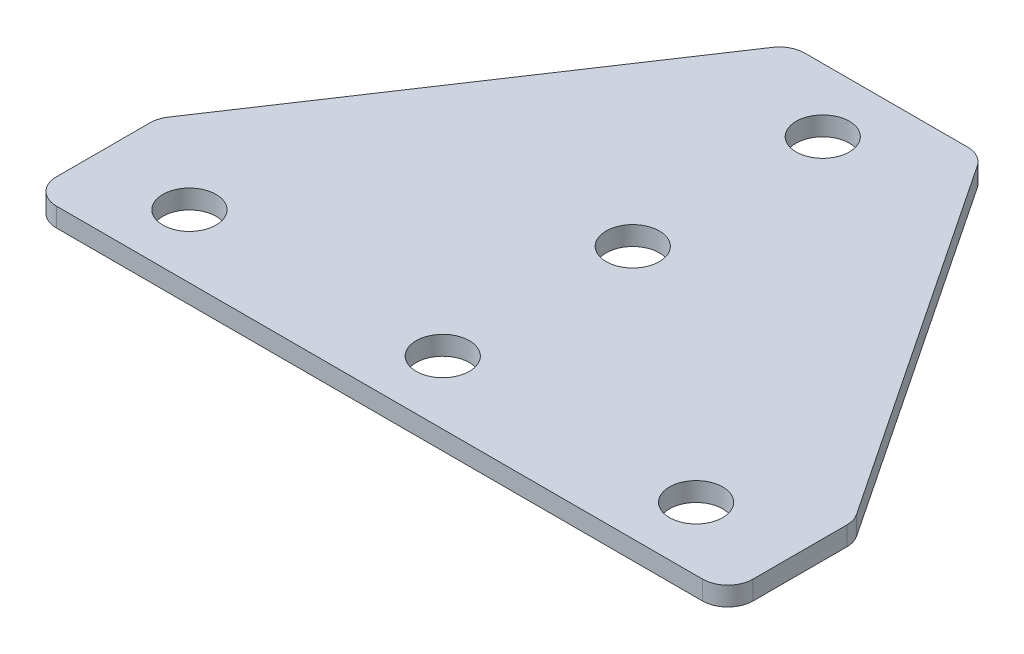
ISO-10303-21;
HEADER;
FILE_DESCRIPTION(('STEP AP214'),'2;1');
FILE_NAME('part.step','',(''),(''),'','','');
FILE_SCHEMA(('AUTOMOTIVE_DESIGN { 1 0 10303 214 1 1 1 1 }'));
ENDSEC;
DATA;
#1=APPLICATION_CONTEXT('core data for automotive mechanical design processes');
#2=APPLICATION_PROTOCOL_DEFINITION('international standard','automotive_design',2000,#1);
#3=PRODUCT_CONTEXT('',#1,'mechanical');
#4=PRODUCT('Part','Part','',(#3));
#5=PRODUCT_RELATED_PRODUCT_CATEGORY('part','',(#4));
#6=PRODUCT_DEFINITION_FORMATION('','',#4);
#7=PRODUCT_DEFINITION_CONTEXT('part definition',#1,'design');
#8=PRODUCT_DEFINITION('design','',#6,#7);
#9=PRODUCT_DEFINITION_SHAPE('','',#8);
#10=(LENGTH_UNIT() NAMED_UNIT(*) SI_UNIT(.MILLI.,.METRE.));
#11=(NAMED_UNIT(*) PLANE_ANGLE_UNIT() SI_UNIT($,.RADIAN.));
#12=(NAMED_UNIT(*) SI_UNIT($,.STERADIAN.) SOLID_ANGLE_UNIT());
#13=UNCERTAINTY_MEASURE_WITH_UNIT(LENGTH_MEASURE(1.E-05),#10,'distance_accuracy_value','');
#14=(GEOMETRIC_REPRESENTATION_CONTEXT(3) GLOBAL_UNCERTAINTY_ASSIGNED_CONTEXT((#13)) GLOBAL_UNIT_ASSIGNED_CONTEXT((#10,
#11,#12)) REPRESENTATION_CONTEXT('',''));
#15=CARTESIAN_POINT('',(0.,0.,0.));
#16=DIRECTION('',(0.,0.,1.));
#17=DIRECTION('',(1.,0.,0.));
#18=AXIS2_PLACEMENT_3D('',#15,#16,#17);
#19=CARTESIAN_POINT('',(0.,1.5,0.));
#20=DIRECTION('',(0.,1.,0.));
#21=DIRECTION('',(0.,0.,1.));
#22=AXIS2_PLACEMENT_3D('',#19,#20,#21);
#23=PLANE('',#22);
#24=CARTESIAN_POINT('',(27.5,1.5,-35.));
#25=DIRECTION('',(0.,1.,0.));
#26=DIRECTION('',(0.,0.,1.));
#27=AXIS2_PLACEMENT_3D('',#24,#25,#26);
#28=CIRCLE('',#27,2.1);
#29=CARTESIAN_POINT('',(27.5,1.5,-32.9));
#30=VERTEX_POINT('',#29);
#31=EDGE_CURVE('E250',#30,#30,#28,.T.);
#32=ORIENTED_EDGE('',*,*,#31,.F.);
#33=EDGE_LOOP('',(#32));
#34=FACE_BOUND('',#33,.T.);
#35=CARTESIAN_POINT('',(47.5,1.5,-5.));
#36=DIRECTION('',(0.,1.,0.));
#37=DIRECTION('',(0.,0.,-1.));
#38=AXIS2_PLACEMENT_3D('',#35,#36,#37);
#39=CIRCLE('',#38,2.1);
#40=CARTESIAN_POINT('',(47.5,1.5,-7.1));
#41=VERTEX_POINT('',#40);
#42=EDGE_CURVE('E239',#41,#41,#39,.T.);
#43=ORIENTED_EDGE('',*,*,#42,.F.);
#44=EDGE_LOOP('',(#43));
#45=FACE_BOUND('',#44,.T.);
#46=DIRECTION('',(-0.554700196225229,0.,0.832050294337843));
#47=VECTOR('',#46,1.);
#48=CARTESIAN_POINT('',(20.,1.5,-40.));
#49=LINE('',#48,#47);
#50=CARTESIAN_POINT('',(19.4062669283003,1.5,-39.1094003924505));
#51=VERTEX_POINT('',#50);
#52=CARTESIAN_POINT('',(0.335899411324295,1.5,-10.5038491169865));
#53=VERTEX_POINT('',#52);
#54=EDGE_CURVE('E162',#51,#53,#49,.T.);
#55=ORIENTED_EDGE('',*,*,#54,.T.);
#56=CARTESIAN_POINT('',(1.99999999999997,1.5,-9.39444872453602));
#57=DIRECTION('',(0.,1.,0.));
#58=DIRECTION('',(0.,0.,1.));
#59=AXIS2_PLACEMENT_3D('',#56,#57,#58);
#60=CIRCLE('',#59,2.);
#61=CARTESIAN_POINT('',(0.,1.5,-9.39444872453601));
#62=VERTEX_POINT('',#61);
#63=EDGE_CURVE('E195',#53,#62,#60,.T.);
#64=ORIENTED_EDGE('',*,*,#63,.T.);
#65=DIRECTION('',(0.,0.,1.));
#66=VECTOR('',#65,1.);
#67=CARTESIAN_POINT('',(0.,1.5,-9.99999999999999));
#68=LINE('',#67,#66);
#69=CARTESIAN_POINT('',(0.,1.5,-1.99999999999999));
#70=VERTEX_POINT('',#69);
#71=EDGE_CURVE('E145',#62,#70,#68,.T.);
#72=ORIENTED_EDGE('',*,*,#71,.T.);
#73=CARTESIAN_POINT('',(1.99999999999999,1.5,-2.));
#74=DIRECTION('',(0.,1.,0.));
#75=DIRECTION('',(0.,0.,1.));
#76=AXIS2_PLACEMENT_3D('',#73,#74,#75);
#77=CIRCLE('',#76,2.);
#78=CARTESIAN_POINT('',(1.99999999999999,1.5,0.));
#79=VERTEX_POINT('',#78);
#80=EDGE_CURVE('E193',#70,#79,#77,.T.);
#81=ORIENTED_EDGE('',*,*,#80,.T.);
#82=DIRECTION('',(1.,0.,0.));
#83=VECTOR('',#82,1.);
#84=CARTESIAN_POINT('',(0.,1.5,0.));
#85=LINE('',#84,#83);
#86=CARTESIAN_POINT('',(53.,1.5,0.));
#87=VERTEX_POINT('',#86);
#88=EDGE_CURVE('E234',#79,#87,#85,.T.);
#89=ORIENTED_EDGE('',*,*,#88,.T.);
#90=CARTESIAN_POINT('',(53.,1.5,-2.));
#91=DIRECTION('',(0.,1.,0.));
#92=DIRECTION('',(0.,0.,1.));
#93=AXIS2_PLACEMENT_3D('',#90,#91,#92);
#94=CIRCLE('',#93,2.);
#95=CARTESIAN_POINT('',(55.,1.5,-2.));
#96=VERTEX_POINT('',#95);
#97=EDGE_CURVE('E191',#87,#96,#94,.T.);
#98=ORIENTED_EDGE('',*,*,#97,.T.);
#99=DIRECTION('',(0.,0.,-1.));
#100=VECTOR('',#99,1.);
#101=CARTESIAN_POINT('',(55.,1.5,0.));
#102=LINE('',#101,#100);
#103=CARTESIAN_POINT('',(55.,1.5,-9.39444872453602));
#104=VERTEX_POINT('',#103);
#105=EDGE_CURVE('E229',#96,#104,#102,.T.);
#106=ORIENTED_EDGE('',*,*,#105,.T.);
#107=CARTESIAN_POINT('',(53.,1.5,-9.39444872453602));
#108=DIRECTION('',(0.,1.,0.));
#109=DIRECTION('',(0.,0.,1.));
#110=AXIS2_PLACEMENT_3D('',#107,#108,#109);
#111=CIRCLE('',#110,2.);
#112=CARTESIAN_POINT('',(54.6641005886757,1.5,-10.5038491169865));
#113=VERTEX_POINT('',#112);
#114=EDGE_CURVE('E189',#104,#113,#111,.T.);
#115=ORIENTED_EDGE('',*,*,#114,.T.);
#116=DIRECTION('',(-0.554700196225229,0.,-0.832050294337844));
#117=VECTOR('',#116,1.);
#118=CARTESIAN_POINT('',(55.,1.5,-10.));
#119=LINE('',#118,#117);
#120=CARTESIAN_POINT('',(35.5937330716997,1.5,-39.1094003924505));
#121=VERTEX_POINT('',#120);
#122=EDGE_CURVE('E217',#113,#121,#119,.T.);
#123=ORIENTED_EDGE('',*,*,#122,.T.);
#124=CARTESIAN_POINT('',(33.929632483024,1.5,-38.));
#125=DIRECTION('',(0.,1.,0.));
#126=DIRECTION('',(0.,0.,1.));
#127=AXIS2_PLACEMENT_3D('',#124,#125,#126);
#128=CIRCLE('',#127,2.);
#129=CARTESIAN_POINT('',(33.929632483024,1.5,-40.));
#130=VERTEX_POINT('',#129);
#131=EDGE_CURVE('E56',#121,#130,#128,.T.);
#132=ORIENTED_EDGE('',*,*,#131,.T.);
#133=DIRECTION('',(-1.,0.,0.));
#134=VECTOR('',#133,1.);
#135=CARTESIAN_POINT('',(35.,1.5,-40.));
#136=LINE('',#135,#134);
#137=CARTESIAN_POINT('',(21.070367516976,1.5,-40.));
#138=VERTEX_POINT('',#137);
#139=EDGE_CURVE('E226',#130,#138,#136,.T.);
#140=ORIENTED_EDGE('',*,*,#139,.T.);
#141=CARTESIAN_POINT('',(21.070367516976,1.5,-38.));
#142=DIRECTION('',(0.,1.,0.));
#143=DIRECTION('',(0.,0.,1.));
#144=AXIS2_PLACEMENT_3D('',#141,#142,#143);
#145=CIRCLE('',#144,2.);
#146=EDGE_CURVE('E186',#138,#51,#145,.T.);
#147=ORIENTED_EDGE('',*,*,#146,.T.);
#148=EDGE_LOOP('',(#55,#64,#72,#81,#89,#98,#106,#115,#123,#132,#140,#147));
#149=FACE_BOUND('',#148,.T.);
#150=CARTESIAN_POINT('',(7.5,1.5,-5.));
#151=DIRECTION('',(0.,1.,0.));
#152=DIRECTION('',(0.,0.,1.));
#153=AXIS2_PLACEMENT_3D('',#150,#151,#152);
#154=CIRCLE('',#153,2.1);
#155=CARTESIAN_POINT('',(7.5,1.5,-2.90000000000001));
#156=VERTEX_POINT('',#155);
#157=EDGE_CURVE('E153',#156,#156,#154,.T.);
#158=ORIENTED_EDGE('',*,*,#157,.F.);
#159=EDGE_LOOP('',(#158));
#160=FACE_BOUND('',#159,.T.);
#161=CARTESIAN_POINT('',(27.5,1.5,-5.));
#162=DIRECTION('',(0.,1.,0.));
#163=DIRECTION('',(0.,0.,1.));
#164=AXIS2_PLACEMENT_3D('',#161,#162,#163);
#165=CIRCLE('',#164,2.1);
#166=CARTESIAN_POINT('',(27.5,1.5,-2.9));
#167=VERTEX_POINT('',#166);
#168=EDGE_CURVE('E244',#167,#167,#165,.T.);
#169=ORIENTED_EDGE('',*,*,#168,.F.);
#170=EDGE_LOOP('',(#169));
#171=FACE_BOUND('',#170,.T.);
#172=CARTESIAN_POINT('',(27.5,1.5,-20.));
#173=DIRECTION('',(0.,1.,0.));
#174=DIRECTION('',(0.,0.,1.));
#175=AXIS2_PLACEMENT_3D('',#172,#173,#174);
#176=CIRCLE('',#175,2.1);
#177=CARTESIAN_POINT('',(27.5,1.5,-17.9));
#178=VERTEX_POINT('',#177);
#179=EDGE_CURVE('E256',#178,#178,#176,.T.);
#180=ORIENTED_EDGE('',*,*,#179,.F.);
#181=EDGE_LOOP('',(#180));
#182=FACE_BOUND('',#181,.T.);
#183=ADVANCED_FACE('F35',(#34,#45,#149,#160,#171,#182),#23,.T.);
#184=CARTESIAN_POINT('',(0.,0.,0.));
#185=DIRECTION('',(0.,1.,0.));
#186=DIRECTION('',(0.,0.,1.));
#187=AXIS2_PLACEMENT_3D('',#184,#185,#186);
#188=PLANE('',#187);
#189=DIRECTION('',(0.,0.,1.));
#190=VECTOR('',#189,1.);
#191=CARTESIAN_POINT('',(0.,0.,-9.99999999999999));
#192=LINE('',#191,#190);
#193=CARTESIAN_POINT('',(0.,0.,-9.39444872453601));
#194=VERTEX_POINT('',#193);
#195=CARTESIAN_POINT('',(0.,0.,-1.99999999999999));
#196=VERTEX_POINT('',#195);
#197=EDGE_CURVE('E142',#194,#196,#192,.T.);
#198=ORIENTED_EDGE('',*,*,#197,.F.);
#199=CARTESIAN_POINT('',(1.99999999999997,0.,-9.39444872453602));
#200=DIRECTION('',(0.,1.,0.));
#201=DIRECTION('',(0.,0.,1.));
#202=AXIS2_PLACEMENT_3D('',#199,#200,#201);
#203=CIRCLE('',#202,2.);
#204=CARTESIAN_POINT('',(0.335899411324295,0.,-10.5038491169865));
#205=VERTEX_POINT('',#204);
#206=EDGE_CURVE('E125',#194,#205,#203,.F.);
#207=ORIENTED_EDGE('',*,*,#206,.T.);
#208=DIRECTION('',(-0.554700196225229,0.,0.832050294337843));
#209=VECTOR('',#208,1.);
#210=CARTESIAN_POINT('',(20.,0.,-40.));
#211=LINE('',#210,#209);
#212=CARTESIAN_POINT('',(19.4062669283003,0.,-39.1094003924505));
#213=VERTEX_POINT('',#212);
#214=EDGE_CURVE('E172',#213,#205,#211,.T.);
#215=ORIENTED_EDGE('',*,*,#214,.F.);
#216=CARTESIAN_POINT('',(21.070367516976,0.,-38.));
#217=DIRECTION('',(0.,1.,0.));
#218=DIRECTION('',(0.,0.,1.));
#219=AXIS2_PLACEMENT_3D('',#216,#217,#218);
#220=CIRCLE('',#219,2.);
#221=CARTESIAN_POINT('',(21.070367516976,0.,-40.));
#222=VERTEX_POINT('',#221);
#223=EDGE_CURVE('E146',#213,#222,#220,.F.);
#224=ORIENTED_EDGE('',*,*,#223,.T.);
#225=DIRECTION('',(-1.,0.,0.));
#226=VECTOR('',#225,1.);
#227=CARTESIAN_POINT('',(35.,0.,-40.));
#228=LINE('',#227,#226);
#229=CARTESIAN_POINT('',(33.929632483024,0.,-40.));
#230=VERTEX_POINT('',#229);
#231=EDGE_CURVE('E170',#230,#222,#228,.T.);
#232=ORIENTED_EDGE('',*,*,#231,.F.);
#233=CARTESIAN_POINT('',(33.929632483024,0.,-38.));
#234=DIRECTION('',(0.,1.,0.));
#235=DIRECTION('',(0.,0.,1.));
#236=AXIS2_PLACEMENT_3D('',#233,#234,#235);
#237=CIRCLE('',#236,2.);
#238=CARTESIAN_POINT('',(35.5937330716997,0.,-39.1094003924505));
#239=VERTEX_POINT('',#238);
#240=EDGE_CURVE('E176',#230,#239,#237,.F.);
#241=ORIENTED_EDGE('',*,*,#240,.T.);
#242=DIRECTION('',(-0.554700196225229,0.,-0.832050294337844));
#243=VECTOR('',#242,1.);
#244=CARTESIAN_POINT('',(55.,0.,-10.));
#245=LINE('',#244,#243);
#246=CARTESIAN_POINT('',(54.6641005886757,0.,-10.5038491169865));
#247=VERTEX_POINT('',#246);
#248=EDGE_CURVE('E167',#247,#239,#245,.T.);
#249=ORIENTED_EDGE('',*,*,#248,.F.);
#250=CARTESIAN_POINT('',(53.,0.,-9.39444872453602));
#251=DIRECTION('',(0.,1.,0.));
#252=DIRECTION('',(0.,0.,1.));
#253=AXIS2_PLACEMENT_3D('',#250,#251,#252);
#254=CIRCLE('',#253,2.);
#255=CARTESIAN_POINT('',(55.,0.,-9.39444872453602));
#256=VERTEX_POINT('',#255);
#257=EDGE_CURVE('E178',#247,#256,#254,.F.);
#258=ORIENTED_EDGE('',*,*,#257,.T.);
#259=DIRECTION('',(0.,0.,-1.));
#260=VECTOR('',#259,1.);
#261=CARTESIAN_POINT('',(55.,0.,0.));
#262=LINE('',#261,#260);
#263=CARTESIAN_POINT('',(55.,0.,-2.));
#264=VERTEX_POINT('',#263);
#265=EDGE_CURVE('E156',#264,#256,#262,.T.);
#266=ORIENTED_EDGE('',*,*,#265,.F.);
#267=CARTESIAN_POINT('',(53.,0.,-2.));
#268=DIRECTION('',(0.,1.,0.));
#269=DIRECTION('',(0.,0.,1.));
#270=AXIS2_PLACEMENT_3D('',#267,#268,#269);
#271=CIRCLE('',#270,2.);
#272=CARTESIAN_POINT('',(53.,0.,0.));
#273=VERTEX_POINT('',#272);
#274=EDGE_CURVE('E180',#264,#273,#271,.F.);
#275=ORIENTED_EDGE('',*,*,#274,.T.);
#276=DIRECTION('',(1.,0.,0.));
#277=VECTOR('',#276,1.);
#278=CARTESIAN_POINT('',(0.,0.,0.));
#279=LINE('',#278,#277);
#280=CARTESIAN_POINT('',(1.99999999999999,0.,0.));
#281=VERTEX_POINT('',#280);
#282=EDGE_CURVE('E152',#281,#273,#279,.T.);
#283=ORIENTED_EDGE('',*,*,#282,.F.);
#284=CARTESIAN_POINT('',(1.99999999999999,0.,-2.));
#285=DIRECTION('',(0.,1.,0.));
#286=DIRECTION('',(0.,0.,1.));
#287=AXIS2_PLACEMENT_3D('',#284,#285,#286);
#288=CIRCLE('',#287,2.);
#289=EDGE_CURVE('E136',#281,#196,#288,.F.);
#290=ORIENTED_EDGE('',*,*,#289,.T.);
#291=EDGE_LOOP('',(#198,#207,#215,#224,#232,#241,#249,#258,#266,#275,#283,#290));
#292=FACE_BOUND('',#291,.T.);
#293=CARTESIAN_POINT('',(7.5,0.,-5.));
#294=DIRECTION('',(0.,1.,0.));
#295=DIRECTION('',(0.,0.,1.));
#296=AXIS2_PLACEMENT_3D('',#293,#294,#295);
#297=CIRCLE('',#296,2.1);
#298=CARTESIAN_POINT('',(7.5,0.,-2.90000000000001));
#299=VERTEX_POINT('',#298);
#300=EDGE_CURVE('E159',#299,#299,#297,.T.);
#301=ORIENTED_EDGE('',*,*,#300,.T.);
#302=EDGE_LOOP('',(#301));
#303=FACE_BOUND('',#302,.T.);
#304=CARTESIAN_POINT('',(47.5,0.,-5.));
#305=DIRECTION('',(0.,1.,0.));
#306=DIRECTION('',(0.,0.,-1.));
#307=AXIS2_PLACEMENT_3D('',#304,#305,#306);
#308=CIRCLE('',#307,2.1);
#309=CARTESIAN_POINT('',(47.5,0.,-7.1));
#310=VERTEX_POINT('',#309);
#311=EDGE_CURVE('E241',#310,#310,#308,.T.);
#312=ORIENTED_EDGE('',*,*,#311,.T.);
#313=EDGE_LOOP('',(#312));
#314=FACE_BOUND('',#313,.T.);
#315=CARTESIAN_POINT('',(27.5,0.,-5.));
#316=DIRECTION('',(0.,1.,0.));
#317=DIRECTION('',(0.,0.,1.));
#318=AXIS2_PLACEMENT_3D('',#315,#316,#317);
#319=CIRCLE('',#318,2.1);
#320=CARTESIAN_POINT('',(27.5,0.,-2.9));
#321=VERTEX_POINT('',#320);
#322=EDGE_CURVE('E247',#321,#321,#319,.T.);
#323=ORIENTED_EDGE('',*,*,#322,.T.);
#324=EDGE_LOOP('',(#323));
#325=FACE_BOUND('',#324,.T.);
#326=CARTESIAN_POINT('',(27.5,0.,-35.));
#327=DIRECTION('',(0.,1.,0.));
#328=DIRECTION('',(0.,0.,1.));
#329=AXIS2_PLACEMENT_3D('',#326,#327,#328);
#330=CIRCLE('',#329,2.1);
#331=CARTESIAN_POINT('',(27.5,0.,-32.9));
#332=VERTEX_POINT('',#331);
#333=EDGE_CURVE('E253',#332,#332,#330,.T.);
#334=ORIENTED_EDGE('',*,*,#333,.T.);
#335=EDGE_LOOP('',(#334));
#336=FACE_BOUND('',#335,.T.);
#337=CARTESIAN_POINT('',(27.5,0.,-20.));
#338=DIRECTION('',(0.,1.,0.));
#339=DIRECTION('',(0.,0.,1.));
#340=AXIS2_PLACEMENT_3D('',#337,#338,#339);
#341=CIRCLE('',#340,2.1);
#342=CARTESIAN_POINT('',(27.5,0.,-17.9));
#343=VERTEX_POINT('',#342);
#344=EDGE_CURVE('E259',#343,#343,#341,.T.);
#345=ORIENTED_EDGE('',*,*,#344,.T.);
#346=EDGE_LOOP('',(#345));
#347=FACE_BOUND('',#346,.T.);
#348=ADVANCED_FACE('F149',(#292,#303,#314,#325,#336,#347),#188,.F.);
#349=CARTESIAN_POINT('',(0.,1.5,-9.99999999999999));
#350=DIRECTION('',(1.,0.,0.));
#351=DIRECTION('',(0.,0.,-1.));
#352=AXIS2_PLACEMENT_3D('',#349,#350,#351);
#353=PLANE('',#352);
#354=ORIENTED_EDGE('',*,*,#71,.F.);
#355=DIRECTION('',(0.,-1.,0.));
#356=VECTOR('',#355,1.);
#357=CARTESIAN_POINT('',(0.,1.5,-9.39444872453601));
#358=LINE('',#357,#356);
#359=EDGE_CURVE('E129',#62,#194,#358,.T.);
#360=ORIENTED_EDGE('',*,*,#359,.T.);
#361=ORIENTED_EDGE('',*,*,#197,.T.);
#362=DIRECTION('',(0.,-1.,0.));
#363=VECTOR('',#362,1.);
#364=CARTESIAN_POINT('',(0.,1.5,-1.99999999999999));
#365=LINE('',#364,#363);
#366=EDGE_CURVE('E147',#196,#70,#365,.F.);
#367=ORIENTED_EDGE('',*,*,#366,.T.);
#368=EDGE_LOOP('',(#354,#360,#361,#367));
#369=FACE_BOUND('',#368,.T.);
#370=ADVANCED_FACE('F141',(#369),#353,.F.);
#371=CARTESIAN_POINT('',(0.,1.5,0.));
#372=DIRECTION('',(0.,0.,-1.));
#373=DIRECTION('',(-1.,0.,0.));
#374=AXIS2_PLACEMENT_3D('',#371,#372,#373);
#375=PLANE('',#374);
#376=ORIENTED_EDGE('',*,*,#88,.F.);
#377=DIRECTION('',(0.,-1.,0.));
#378=VECTOR('',#377,1.);
#379=CARTESIAN_POINT('',(1.99999999999999,1.5,0.));
#380=LINE('',#379,#378);
#381=EDGE_CURVE('E199',#79,#281,#380,.T.);
#382=ORIENTED_EDGE('',*,*,#381,.T.);
#383=ORIENTED_EDGE('',*,*,#282,.T.);
#384=DIRECTION('',(0.,-1.,0.));
#385=VECTOR('',#384,1.);
#386=CARTESIAN_POINT('',(53.,1.5,0.));
#387=LINE('',#386,#385);
#388=EDGE_CURVE('E197',#273,#87,#387,.F.);
#389=ORIENTED_EDGE('',*,*,#388,.T.);
#390=EDGE_LOOP('',(#376,#382,#383,#389));
#391=FACE_BOUND('',#390,.T.);
#392=ADVANCED_FACE('F292',(#391),#375,.F.);
#393=CARTESIAN_POINT('',(55.,1.5,0.));
#394=DIRECTION('',(-1.,0.,0.));
#395=DIRECTION('',(0.,0.,1.));
#396=AXIS2_PLACEMENT_3D('',#393,#394,#395);
#397=PLANE('',#396);
#398=ORIENTED_EDGE('',*,*,#105,.F.);
#399=DIRECTION('',(0.,-1.,0.));
#400=VECTOR('',#399,1.);
#401=CARTESIAN_POINT('',(55.,1.5,-2.));
#402=LINE('',#401,#400);
#403=EDGE_CURVE('E204',#96,#264,#402,.T.);
#404=ORIENTED_EDGE('',*,*,#403,.T.);
#405=ORIENTED_EDGE('',*,*,#265,.T.);
#406=DIRECTION('',(0.,-1.,0.));
#407=VECTOR('',#406,1.);
#408=CARTESIAN_POINT('',(55.,1.5,-9.39444872453602));
#409=LINE('',#408,#407);
#410=EDGE_CURVE('E202',#256,#104,#409,.F.);
#411=ORIENTED_EDGE('',*,*,#410,.T.);
#412=EDGE_LOOP('',(#398,#404,#405,#411));
#413=FACE_BOUND('',#412,.T.);
#414=ADVANCED_FACE('F289',(#413),#397,.F.);
#415=CARTESIAN_POINT('',(55.,1.5,-10.));
#416=DIRECTION('',(-0.832050294337844,0.,0.554700196225229));
#417=DIRECTION('',(0.554700196225229,0.,0.832050294337844));
#418=AXIS2_PLACEMENT_3D('',#415,#416,#417);
#419=PLANE('',#418);
#420=ORIENTED_EDGE('',*,*,#122,.F.);
#421=DIRECTION('',(0.,-1.,0.));
#422=VECTOR('',#421,1.);
#423=CARTESIAN_POINT('',(54.6641005886757,1.5,-10.5038491169865));
#424=LINE('',#423,#422);
#425=EDGE_CURVE('E209',#113,#247,#424,.T.);
#426=ORIENTED_EDGE('',*,*,#425,.T.);
#427=ORIENTED_EDGE('',*,*,#248,.T.);
#428=DIRECTION('',(0.,-1.,0.));
#429=VECTOR('',#428,1.);
#430=CARTESIAN_POINT('',(35.5937330716997,1.5,-39.1094003924505));
#431=LINE('',#430,#429);
#432=EDGE_CURVE('E207',#239,#121,#431,.F.);
#433=ORIENTED_EDGE('',*,*,#432,.T.);
#434=EDGE_LOOP('',(#420,#426,#427,#433));
#435=FACE_BOUND('',#434,.T.);
#436=ADVANCED_FACE('F215',(#435),#419,.F.);
#437=CARTESIAN_POINT('',(35.,1.5,-40.));
#438=DIRECTION('',(0.,0.,1.));
#439=DIRECTION('',(1.,0.,0.));
#440=AXIS2_PLACEMENT_3D('',#437,#438,#439);
#441=PLANE('',#440);
#442=ORIENTED_EDGE('',*,*,#139,.F.);
#443=DIRECTION('',(0.,-1.,0.));
#444=VECTOR('',#443,1.);
#445=CARTESIAN_POINT('',(33.929632483024,1.5,-40.));
#446=LINE('',#445,#444);
#447=EDGE_CURVE('E11',#130,#230,#446,.T.);
#448=ORIENTED_EDGE('',*,*,#447,.T.);
#449=ORIENTED_EDGE('',*,*,#231,.T.);
#450=DIRECTION('',(0.,-1.,0.));
#451=VECTOR('',#450,1.);
#452=CARTESIAN_POINT('',(21.070367516976,1.5,-40.));
#453=LINE('',#452,#451);
#454=EDGE_CURVE('E43',#222,#138,#453,.F.);
#455=ORIENTED_EDGE('',*,*,#454,.T.);
#456=EDGE_LOOP('',(#442,#448,#449,#455));
#457=FACE_BOUND('',#456,.T.);
#458=ADVANCED_FACE('F225',(#457),#441,.F.);
#459=CARTESIAN_POINT('',(20.,1.5,-40.));
#460=DIRECTION('',(0.832050294337843,0.,0.55470019622523));
#461=DIRECTION('',(0.55470019622523,0.,-0.832050294337843));
#462=AXIS2_PLACEMENT_3D('',#459,#460,#461);
#463=PLANE('',#462);
#464=ORIENTED_EDGE('',*,*,#214,.T.);
#465=DIRECTION('',(0.,-1.,0.));
#466=VECTOR('',#465,1.);
#467=CARTESIAN_POINT('',(0.335899411324281,1.5,-10.5038491169865));
#468=LINE('',#467,#466);
#469=EDGE_CURVE('E130',#205,#53,#468,.F.);
#470=ORIENTED_EDGE('',*,*,#469,.T.);
#471=ORIENTED_EDGE('',*,*,#54,.F.);
#472=DIRECTION('',(0.,-1.,0.));
#473=VECTOR('',#472,1.);
#474=CARTESIAN_POINT('',(19.4062669283003,1.5,-39.1094003924505));
#475=LINE('',#474,#473);
#476=EDGE_CURVE('E135',#51,#213,#475,.T.);
#477=ORIENTED_EDGE('',*,*,#476,.T.);
#478=EDGE_LOOP('',(#464,#470,#471,#477));
#479=FACE_BOUND('',#478,.T.);
#480=ADVANCED_FACE('F281',(#479),#463,.F.);
#481=CARTESIAN_POINT('',(7.5,1.5,-5.));
#482=DIRECTION('',(0.,-1.,0.));
#483=DIRECTION('',(0.,0.,-1.));
#484=AXIS2_PLACEMENT_3D('',#481,#482,#483);
#485=CYLINDRICAL_SURFACE('',#484,2.1);
#486=ORIENTED_EDGE('',*,*,#157,.T.);
#487=EDGE_LOOP('',(#486));
#488=FACE_BOUND('',#487,.T.);
#489=ORIENTED_EDGE('',*,*,#300,.F.);
#490=EDGE_LOOP('',(#489));
#491=FACE_BOUND('',#490,.T.);
#492=ADVANCED_FACE('F278',(#488,#491),#485,.F.);
#493=CARTESIAN_POINT('',(47.5,1.5,-5.));
#494=DIRECTION('',(0.,-1.,0.));
#495=DIRECTION('',(0.,0.,-1.));
#496=AXIS2_PLACEMENT_3D('',#493,#494,#495);
#497=CYLINDRICAL_SURFACE('',#496,2.1);
#498=ORIENTED_EDGE('',*,*,#42,.T.);
#499=EDGE_LOOP('',(#498));
#500=FACE_BOUND('',#499,.T.);
#501=ORIENTED_EDGE('',*,*,#311,.F.);
#502=EDGE_LOOP('',(#501));
#503=FACE_BOUND('',#502,.T.);
#504=ADVANCED_FACE('F337',(#500,#503),#497,.F.);
#505=CARTESIAN_POINT('',(27.5,1.5,-5.));
#506=DIRECTION('',(0.,-1.,0.));
#507=DIRECTION('',(0.,0.,-1.));
#508=AXIS2_PLACEMENT_3D('',#505,#506,#507);
#509=CYLINDRICAL_SURFACE('',#508,2.1);
#510=ORIENTED_EDGE('',*,*,#168,.T.);
#511=EDGE_LOOP('',(#510));
#512=FACE_BOUND('',#511,.T.);
#513=ORIENTED_EDGE('',*,*,#322,.F.);
#514=EDGE_LOOP('',(#513));
#515=FACE_BOUND('',#514,.T.);
#516=ADVANCED_FACE('F333',(#512,#515),#509,.F.);
#517=CARTESIAN_POINT('',(27.5,1.5,-35.));
#518=DIRECTION('',(0.,-1.,0.));
#519=DIRECTION('',(0.,0.,-1.));
#520=AXIS2_PLACEMENT_3D('',#517,#518,#519);
#521=CYLINDRICAL_SURFACE('',#520,2.1);
#522=ORIENTED_EDGE('',*,*,#31,.T.);
#523=EDGE_LOOP('',(#522));
#524=FACE_BOUND('',#523,.T.);
#525=ORIENTED_EDGE('',*,*,#333,.F.);
#526=EDGE_LOOP('',(#525));
#527=FACE_BOUND('',#526,.T.);
#528=ADVANCED_FACE('F336',(#524,#527),#521,.F.);
#529=CARTESIAN_POINT('',(27.5,1.5,-20.));
#530=DIRECTION('',(0.,-1.,0.));
#531=DIRECTION('',(0.,0.,-1.));
#532=AXIS2_PLACEMENT_3D('',#529,#530,#531);
#533=CYLINDRICAL_SURFACE('',#532,2.1);
#534=ORIENTED_EDGE('',*,*,#179,.T.);
#535=EDGE_LOOP('',(#534));
#536=FACE_BOUND('',#535,.T.);
#537=ORIENTED_EDGE('',*,*,#344,.F.);
#538=EDGE_LOOP('',(#537));
#539=FACE_BOUND('',#538,.T.);
#540=ADVANCED_FACE('F265',(#536,#539),#533,.F.);
#541=CARTESIAN_POINT('',(1.99999999999997,1.5,-9.39444872453602));
#542=DIRECTION('',(0.,-1.,0.));
#543=DIRECTION('',(0.,0.,-1.));
#544=AXIS2_PLACEMENT_3D('',#541,#542,#543);
#545=CYLINDRICAL_SURFACE('',#544,2.);
#546=ORIENTED_EDGE('',*,*,#63,.F.);
#547=ORIENTED_EDGE('',*,*,#469,.F.);
#548=ORIENTED_EDGE('',*,*,#206,.F.);
#549=ORIENTED_EDGE('',*,*,#359,.F.);
#550=EDGE_LOOP('',(#546,#547,#548,#549));
#551=FACE_BOUND('',#550,.T.);
#552=ADVANCED_FACE('F128',(#551),#545,.T.);
#553=CARTESIAN_POINT('',(1.99999999999999,1.5,-2.));
#554=DIRECTION('',(0.,-1.,0.));
#555=DIRECTION('',(0.,0.,-1.));
#556=AXIS2_PLACEMENT_3D('',#553,#554,#555);
#557=CYLINDRICAL_SURFACE('',#556,2.);
#558=ORIENTED_EDGE('',*,*,#80,.F.);
#559=ORIENTED_EDGE('',*,*,#366,.F.);
#560=ORIENTED_EDGE('',*,*,#289,.F.);
#561=ORIENTED_EDGE('',*,*,#381,.F.);
#562=EDGE_LOOP('',(#558,#559,#560,#561));
#563=FACE_BOUND('',#562,.T.);
#564=ADVANCED_FACE('F301',(#563),#557,.T.);
#565=CARTESIAN_POINT('',(53.,1.5,-2.));
#566=DIRECTION('',(0.,-1.,0.));
#567=DIRECTION('',(0.,0.,-1.));
#568=AXIS2_PLACEMENT_3D('',#565,#566,#567);
#569=CYLINDRICAL_SURFACE('',#568,2.);
#570=ORIENTED_EDGE('',*,*,#97,.F.);
#571=ORIENTED_EDGE('',*,*,#388,.F.);
#572=ORIENTED_EDGE('',*,*,#274,.F.);
#573=ORIENTED_EDGE('',*,*,#403,.F.);
#574=EDGE_LOOP('',(#570,#571,#572,#573));
#575=FACE_BOUND('',#574,.T.);
#576=ADVANCED_FACE('F304',(#575),#569,.T.);
#577=CARTESIAN_POINT('',(53.,1.5,-9.39444872453602));
#578=DIRECTION('',(0.,-1.,0.));
#579=DIRECTION('',(0.,0.,-1.));
#580=AXIS2_PLACEMENT_3D('',#577,#578,#579);
#581=CYLINDRICAL_SURFACE('',#580,2.);
#582=ORIENTED_EDGE('',*,*,#114,.F.);
#583=ORIENTED_EDGE('',*,*,#410,.F.);
#584=ORIENTED_EDGE('',*,*,#257,.F.);
#585=ORIENTED_EDGE('',*,*,#425,.F.);
#586=EDGE_LOOP('',(#582,#583,#584,#585));
#587=FACE_BOUND('',#586,.T.);
#588=ADVANCED_FACE('F308',(#587),#581,.T.);
#589=CARTESIAN_POINT('',(33.929632483024,1.5,-38.));
#590=DIRECTION('',(0.,-1.,0.));
#591=DIRECTION('',(0.,0.,-1.));
#592=AXIS2_PLACEMENT_3D('',#589,#590,#591);
#593=CYLINDRICAL_SURFACE('',#592,2.);
#594=ORIENTED_EDGE('',*,*,#131,.F.);
#595=ORIENTED_EDGE('',*,*,#432,.F.);
#596=ORIENTED_EDGE('',*,*,#240,.F.);
#597=ORIENTED_EDGE('',*,*,#447,.F.);
#598=EDGE_LOOP('',(#594,#595,#596,#597));
#599=FACE_BOUND('',#598,.T.);
#600=ADVANCED_FACE('F224',(#599),#593,.T.);
#601=CARTESIAN_POINT('',(21.070367516976,1.5,-38.));
#602=DIRECTION('',(0.,-1.,0.));
#603=DIRECTION('',(0.,0.,-1.));
#604=AXIS2_PLACEMENT_3D('',#601,#602,#603);
#605=CYLINDRICAL_SURFACE('',#604,2.);
#606=ORIENTED_EDGE('',*,*,#146,.F.);
#607=ORIENTED_EDGE('',*,*,#454,.F.);
#608=ORIENTED_EDGE('',*,*,#223,.F.);
#609=ORIENTED_EDGE('',*,*,#476,.F.);
#610=EDGE_LOOP('',(#606,#607,#608,#609));
#611=FACE_BOUND('',#610,.T.);
#612=ADVANCED_FACE('F37',(#611),#605,.T.);
#613=CLOSED_SHELL('',(#183,#348,#370,#392,#414,#436,#458,#480,#492,#504,#516,#528,#540,#552,
#564,#576,#588,#600,#612));
#614=MANIFOLD_SOLID_BREP('B2',#613);
#615=ADVANCED_BREP_SHAPE_REPRESENTATION('',(#18,#614),#14);
#616=SHAPE_DEFINITION_REPRESENTATION(#9,#615);
ENDSEC;
END-ISO-10303-21;
